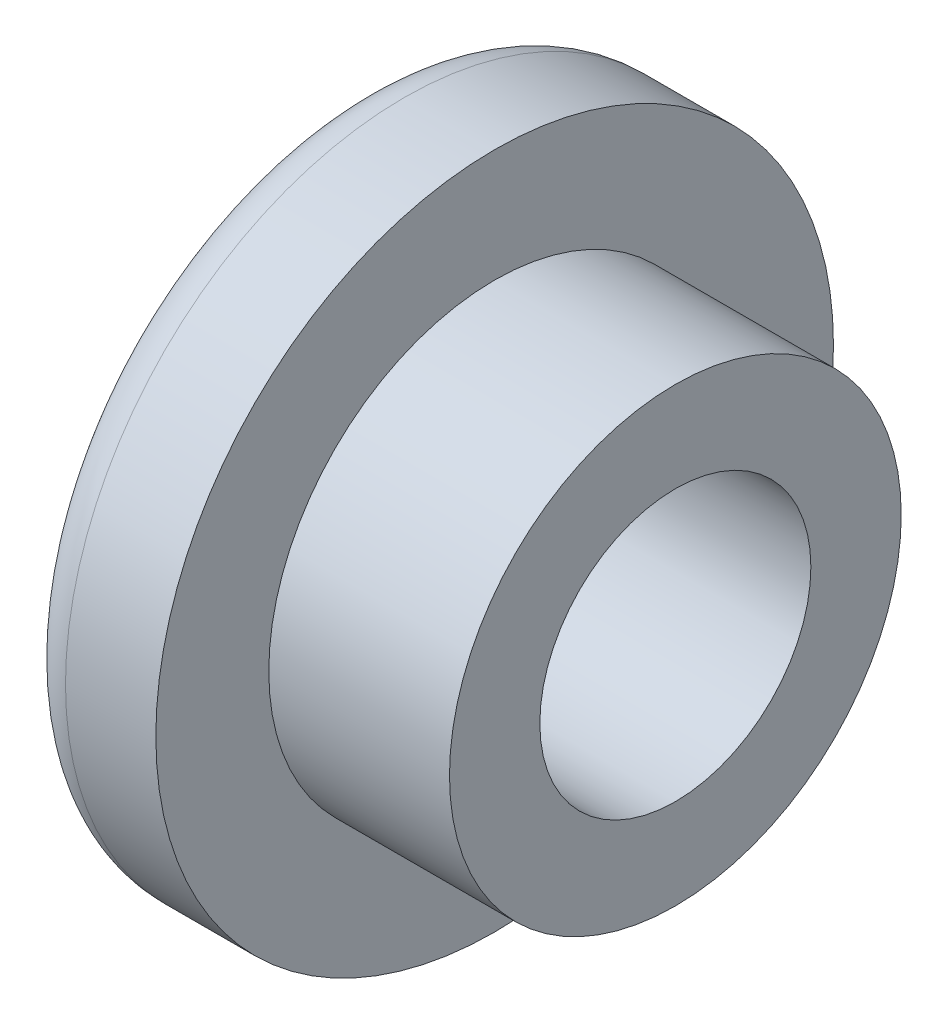
ISO-10303-21;
HEADER;
FILE_DESCRIPTION(('STEP AP214'),'2;1');
FILE_NAME('part.step','',(''),(''),'','','');
FILE_SCHEMA(('AUTOMOTIVE_DESIGN { 1 0 10303 214 1 1 1 1 }'));
ENDSEC;
DATA;
#1=APPLICATION_CONTEXT('core data for automotive mechanical design processes');
#2=APPLICATION_PROTOCOL_DEFINITION('international standard','automotive_design',2000,#1);
#3=PRODUCT_CONTEXT('',#1,'mechanical');
#4=PRODUCT('Part','Part','',(#3));
#5=PRODUCT_RELATED_PRODUCT_CATEGORY('part','',(#4));
#6=PRODUCT_DEFINITION_FORMATION('','',#4);
#7=PRODUCT_DEFINITION_CONTEXT('part definition',#1,'design');
#8=PRODUCT_DEFINITION('design','',#6,#7);
#9=PRODUCT_DEFINITION_SHAPE('','',#8);
#10=(LENGTH_UNIT() NAMED_UNIT(*) SI_UNIT(.MILLI.,.METRE.));
#11=(NAMED_UNIT(*) PLANE_ANGLE_UNIT() SI_UNIT($,.RADIAN.));
#12=(NAMED_UNIT(*) SI_UNIT($,.STERADIAN.) SOLID_ANGLE_UNIT());
#13=UNCERTAINTY_MEASURE_WITH_UNIT(LENGTH_MEASURE(1.E-05),#10,'distance_accuracy_value','');
#14=(GEOMETRIC_REPRESENTATION_CONTEXT(3) GLOBAL_UNCERTAINTY_ASSIGNED_CONTEXT((#13)) GLOBAL_UNIT_ASSIGNED_CONTEXT((#10,
#11,#12)) REPRESENTATION_CONTEXT('',''));
#15=CARTESIAN_POINT('',(0.,0.,0.));
#16=DIRECTION('',(0.,0.,1.));
#17=DIRECTION('',(1.,0.,0.));
#18=AXIS2_PLACEMENT_3D('',#15,#16,#17);
#19=CARTESIAN_POINT('',(3.,15.,0.));
#20=DIRECTION('',(1.,0.,0.));
#21=DIRECTION('',(0.,0.,-1.));
#22=AXIS2_PLACEMENT_3D('',#19,#20,#21);
#23=PLANE('',#22);
#24=CARTESIAN_POINT('',(3.,7.5,0.));
#25=DIRECTION('',(1.,0.,0.));
#26=DIRECTION('',(0.,0.,-1.));
#27=AXIS2_PLACEMENT_3D('',#24,#25,#26);
#28=CIRCLE('',#27,5.);
#29=CARTESIAN_POINT('',(3.,7.5,-5.));
#30=VERTEX_POINT('',#29);
#31=EDGE_CURVE('E10',#30,#30,#28,.T.);
#32=ORIENTED_EDGE('',*,*,#31,.F.);
#33=EDGE_LOOP('',(#32));
#34=FACE_BOUND('',#33,.T.);
#35=CARTESIAN_POINT('',(3.,7.5,0.));
#36=DIRECTION('',(-1.,0.,0.));
#37=DIRECTION('',(0.,0.,1.));
#38=AXIS2_PLACEMENT_3D('',#35,#36,#37);
#39=CIRCLE('',#38,7.5);
#40=CARTESIAN_POINT('',(3.,7.5,7.5));
#41=VERTEX_POINT('',#40);
#42=EDGE_CURVE('E34',#41,#41,#39,.T.);
#43=ORIENTED_EDGE('',*,*,#42,.F.);
#44=EDGE_LOOP('',(#43));
#45=FACE_BOUND('',#44,.T.);
#46=ADVANCED_FACE('F31',(#34,#45),#23,.T.);
#47=CARTESIAN_POINT('',(0.,7.5,0.));
#48=DIRECTION('',(-1.,0.,0.));
#49=DIRECTION('',(0.,0.,1.));
#50=AXIS2_PLACEMENT_3D('',#47,#48,#49);
#51=CYLINDRICAL_SURFACE('',#50,7.5);
#52=ORIENTED_EDGE('',*,*,#42,.T.);
#53=EDGE_LOOP('',(#52));
#54=FACE_BOUND('',#53,.T.);
#55=CARTESIAN_POINT('',(1.00000000000001,7.5,0.));
#56=DIRECTION('',(-1.,0.,0.));
#57=DIRECTION('',(0.,0.,1.));
#58=AXIS2_PLACEMENT_3D('',#55,#56,#57);
#59=CIRCLE('',#58,7.5);
#60=CARTESIAN_POINT('',(1.00000000000001,7.5,7.5));
#61=VERTEX_POINT('',#60);
#62=EDGE_CURVE('E42',#61,#61,#59,.T.);
#63=ORIENTED_EDGE('',*,*,#62,.F.);
#64=EDGE_LOOP('',(#63));
#65=FACE_BOUND('',#64,.T.);
#66=ADVANCED_FACE('F54',(#54,#65),#51,.T.);
#67=CARTESIAN_POINT('',(1.,7.5,0.));
#68=DIRECTION('',(-1.,0.,0.));
#69=DIRECTION('',(0.,0.,1.));
#70=AXIS2_PLACEMENT_3D('',#67,#68,#69);
#71=TOROIDAL_SURFACE('',#70,6.5,1.);
#72=CARTESIAN_POINT('',(0.,7.5,0.));
#73=DIRECTION('',(-1.,0.,0.));
#74=DIRECTION('',(0.,0.,1.));
#75=AXIS2_PLACEMENT_3D('',#72,#73,#74);
#76=CIRCLE('',#75,6.49999999999999);
#77=CARTESIAN_POINT('',(0.,7.5,6.49999999999999));
#78=VERTEX_POINT('',#77);
#79=EDGE_CURVE('E47',#78,#78,#76,.T.);
#80=ORIENTED_EDGE('',*,*,#79,.F.);
#81=EDGE_LOOP('',(#80));
#82=FACE_BOUND('',#81,.T.);
#83=ORIENTED_EDGE('',*,*,#62,.T.);
#84=EDGE_LOOP('',(#83));
#85=FACE_BOUND('',#84,.T.);
#86=ADVANCED_FACE('F52',(#82,#85),#71,.T.);
#87=CARTESIAN_POINT('',(0.,14.,0.));
#88=DIRECTION('',(1.,0.,0.));
#89=DIRECTION('',(0.,0.,-1.));
#90=AXIS2_PLACEMENT_3D('',#87,#88,#89);
#91=PLANE('',#90);
#92=CARTESIAN_POINT('',(0.,7.5,0.));
#93=DIRECTION('',(1.,0.,0.));
#94=DIRECTION('',(0.,0.,-1.));
#95=AXIS2_PLACEMENT_3D('',#92,#93,#94);
#96=CIRCLE('',#95,3.);
#97=CARTESIAN_POINT('',(0.,7.5,-3.));
#98=VERTEX_POINT('',#97);
#99=EDGE_CURVE('E88',#98,#98,#96,.T.);
#100=ORIENTED_EDGE('',*,*,#99,.T.);
#101=EDGE_LOOP('',(#100));
#102=FACE_BOUND('',#101,.T.);
#103=ORIENTED_EDGE('',*,*,#79,.T.);
#104=EDGE_LOOP('',(#103));
#105=FACE_BOUND('',#104,.T.);
#106=ADVANCED_FACE('F61',(#102,#105),#91,.F.);
#107=CARTESIAN_POINT('',(7.,7.5,0.));
#108=DIRECTION('',(-1.,0.,0.));
#109=DIRECTION('',(0.,0.,1.));
#110=AXIS2_PLACEMENT_3D('',#107,#108,#109);
#111=CYLINDRICAL_SURFACE('',#110,5.);
#112=CARTESIAN_POINT('',(7.,7.5,0.));
#113=DIRECTION('',(1.,0.,0.));
#114=DIRECTION('',(0.,0.,-1.));
#115=AXIS2_PLACEMENT_3D('',#112,#113,#114);
#116=CIRCLE('',#115,5.);
#117=CARTESIAN_POINT('',(7.,7.5,-5.));
#118=VERTEX_POINT('',#117);
#119=EDGE_CURVE('E45',#118,#118,#116,.T.);
#120=ORIENTED_EDGE('',*,*,#119,.F.);
#121=EDGE_LOOP('',(#120));
#122=FACE_BOUND('',#121,.T.);
#123=ORIENTED_EDGE('',*,*,#31,.T.);
#124=EDGE_LOOP('',(#123));
#125=FACE_BOUND('',#124,.T.);
#126=ADVANCED_FACE('F68',(#122,#125),#111,.T.);
#127=CARTESIAN_POINT('',(7.,7.5,0.));
#128=DIRECTION('',(1.,0.,0.));
#129=DIRECTION('',(0.,0.,-1.));
#130=AXIS2_PLACEMENT_3D('',#127,#128,#129);
#131=PLANE('',#130);
#132=CARTESIAN_POINT('',(7.,7.5,0.));
#133=DIRECTION('',(-1.,0.,0.));
#134=DIRECTION('',(0.,0.,1.));
#135=AXIS2_PLACEMENT_3D('',#132,#133,#134);
#136=CIRCLE('',#135,3.);
#137=CARTESIAN_POINT('',(7.,7.5,3.));
#138=VERTEX_POINT('',#137);
#139=EDGE_CURVE('E85',#138,#138,#136,.T.);
#140=ORIENTED_EDGE('',*,*,#139,.T.);
#141=EDGE_LOOP('',(#140));
#142=FACE_BOUND('',#141,.T.);
#143=ORIENTED_EDGE('',*,*,#119,.T.);
#144=EDGE_LOOP('',(#143));
#145=FACE_BOUND('',#144,.T.);
#146=ADVANCED_FACE('F72',(#142,#145),#131,.T.);
#147=CARTESIAN_POINT('',(7.,7.5,0.));
#148=DIRECTION('',(-1.,0.,0.));
#149=DIRECTION('',(0.,0.,1.));
#150=AXIS2_PLACEMENT_3D('',#147,#148,#149);
#151=CYLINDRICAL_SURFACE('',#150,3.);
#152=ORIENTED_EDGE('',*,*,#139,.F.);
#153=EDGE_LOOP('',(#152));
#154=FACE_BOUND('',#153,.T.);
#155=ORIENTED_EDGE('',*,*,#99,.F.);
#156=EDGE_LOOP('',(#155));
#157=FACE_BOUND('',#156,.T.);
#158=ADVANCED_FACE('F76',(#154,#157),#151,.F.);
#159=CLOSED_SHELL('',(#46,#66,#86,#106,#126,#146,#158));
#160=MANIFOLD_SOLID_BREP('B2',#159);
#161=ADVANCED_BREP_SHAPE_REPRESENTATION('',(#18,#160),#14);
#162=SHAPE_DEFINITION_REPRESENTATION(#9,#161);
ENDSEC;
END-ISO-10303-21;
